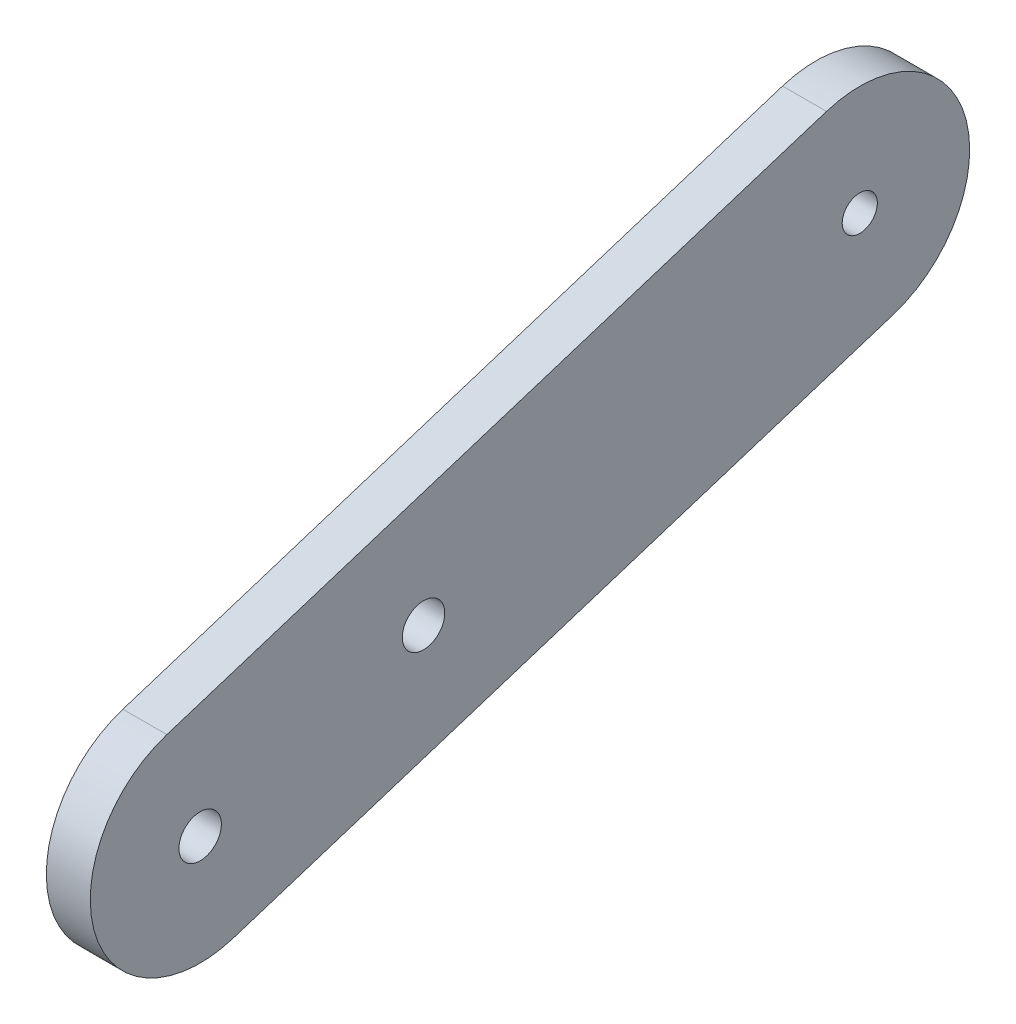
ISO-10303-21;
HEADER;
FILE_DESCRIPTION(('STEP AP214'),'2;1');
FILE_NAME('part.step','',(''),(''),'','','');
FILE_SCHEMA(('AUTOMOTIVE_DESIGN { 1 0 10303 214 1 1 1 1 }'));
ENDSEC;
DATA;
#1=APPLICATION_CONTEXT('core data for automotive mechanical design processes');
#2=APPLICATION_PROTOCOL_DEFINITION('international standard','automotive_design',2000,#1);
#3=PRODUCT_CONTEXT('',#1,'mechanical');
#4=PRODUCT('Part','Part','',(#3));
#5=PRODUCT_RELATED_PRODUCT_CATEGORY('part','',(#4));
#6=PRODUCT_DEFINITION_FORMATION('','',#4);
#7=PRODUCT_DEFINITION_CONTEXT('part definition',#1,'design');
#8=PRODUCT_DEFINITION('design','',#6,#7);
#9=PRODUCT_DEFINITION_SHAPE('','',#8);
#10=(LENGTH_UNIT() NAMED_UNIT(*) SI_UNIT(.MILLI.,.METRE.));
#11=(NAMED_UNIT(*) PLANE_ANGLE_UNIT() SI_UNIT($,.RADIAN.));
#12=(NAMED_UNIT(*) SI_UNIT($,.STERADIAN.) SOLID_ANGLE_UNIT());
#13=UNCERTAINTY_MEASURE_WITH_UNIT(LENGTH_MEASURE(1.E-05),#10,'distance_accuracy_value','');
#14=(GEOMETRIC_REPRESENTATION_CONTEXT(3) GLOBAL_UNCERTAINTY_ASSIGNED_CONTEXT((#13)) GLOBAL_UNIT_ASSIGNED_CONTEXT((#10,
#11,#12)) REPRESENTATION_CONTEXT('',''));
#15=CARTESIAN_POINT('',(0.,0.,0.));
#16=DIRECTION('',(0.,0.,1.));
#17=DIRECTION('',(1.,0.,0.));
#18=AXIS2_PLACEMENT_3D('',#15,#16,#17);
#19=CARTESIAN_POINT('',(-0.50000000278131,88922.8735174239,-279058.176608093));
#20=DIRECTION('',(0.,-0.952925780013262,-0.303203657276947));
#21=DIRECTION('',(0.,0.303203657276947,-0.952925780013262));
#22=AXIS2_PLACEMENT_3D('',#19,#20,#21);
#23=PLANE('',#22);
#24=DIRECTION('',(0.,-0.303203657276947,0.952925780013262));
#25=VECTOR('',#24,1.);
#26=CARTESIAN_POINT('',(-3.50000000278131,88922.8735174239,-279058.176608093));
#27=LINE('',#26,#25);
#28=CARTESIAN_POINT('',(-3.49999999999946,114.475973519718,53.9299584635233));
#29=VERTEX_POINT('',#28);
#30=CARTESIAN_POINT('',(-3.49999999999901,100.149754125628,98.9552194163788));
#31=VERTEX_POINT('',#30);
#32=EDGE_CURVE('E100',#29,#31,#27,.T.);
#33=ORIENTED_EDGE('',*,*,#32,.F.);
#34=DIRECTION('',(-1.,0.,0.));
#35=VECTOR('',#34,1.);
#36=CARTESIAN_POINT('',(-0.499999999999462,114.475973519718,53.9299584635233));
#37=LINE('',#36,#35);
#38=CARTESIAN_POINT('',(-0.499999999999462,114.475973519718,53.9299584635233));
#39=VERTEX_POINT('',#38);
#40=EDGE_CURVE('E11',#39,#29,#37,.T.);
#41=ORIENTED_EDGE('',*,*,#40,.F.);
#42=DIRECTION('',(0.,-0.303203657276947,0.952925780013262));
#43=VECTOR('',#42,1.);
#44=CARTESIAN_POINT('',(-0.50000000278131,88922.8735174239,-279058.176608093));
#45=LINE('',#44,#43);
#46=CARTESIAN_POINT('',(-0.499999999999014,100.149754125628,98.9552194163788));
#47=VERTEX_POINT('',#46);
#48=EDGE_CURVE('E93',#39,#47,#45,.T.);
#49=ORIENTED_EDGE('',*,*,#48,.T.);
#50=DIRECTION('',(-1.,0.,0.));
#51=VECTOR('',#50,1.);
#52=CARTESIAN_POINT('',(-0.499999999999014,100.149754125628,98.9552194163788));
#53=LINE('',#52,#51);
#54=EDGE_CURVE('E38',#47,#31,#53,.T.);
#55=ORIENTED_EDGE('',*,*,#54,.T.);
#56=EDGE_LOOP('',(#33,#41,#49,#55));
#57=FACE_BOUND('',#56,.T.);
#58=ADVANCED_FACE('F35',(#57),#23,.T.);
#59=CARTESIAN_POINT('',(-0.49999999999944,121.622916869839,56.2039858930346));
#60=DIRECTION('',(-1.,0.,0.));
#61=DIRECTION('',(0.,0.,1.));
#62=AXIS2_PLACEMENT_3D('',#59,#60,#61);
#63=CYLINDRICAL_SURFACE('',#62,7.49999999999999);
#64=CARTESIAN_POINT('',(-3.49999999999944,121.622916869839,56.2039858930346));
#65=DIRECTION('',(-1.,0.,0.));
#66=DIRECTION('',(0.,0.,1.));
#67=AXIS2_PLACEMENT_3D('',#64,#65,#66);
#68=CIRCLE('',#67,7.49999999999999);
#69=CARTESIAN_POINT('',(-3.49999999999942,128.769860219924,58.4780133226575));
#70=VERTEX_POINT('',#69);
#71=EDGE_CURVE('E95',#70,#29,#68,.T.);
#72=ORIENTED_EDGE('',*,*,#71,.F.);
#73=DIRECTION('',(-1.,0.,0.));
#74=VECTOR('',#73,1.);
#75=CARTESIAN_POINT('',(-0.499999999999417,128.769860219924,58.4780133226575));
#76=LINE('',#75,#74);
#77=CARTESIAN_POINT('',(-0.499999999999417,128.769860219924,58.4780133226575));
#78=VERTEX_POINT('',#77);
#79=EDGE_CURVE('E44',#78,#70,#76,.T.);
#80=ORIENTED_EDGE('',*,*,#79,.F.);
#81=CARTESIAN_POINT('',(-0.49999999999944,121.622916869839,56.2039858930346));
#82=DIRECTION('',(-1.,0.,0.));
#83=DIRECTION('',(0.,0.,1.));
#84=AXIS2_PLACEMENT_3D('',#81,#82,#83);
#85=CIRCLE('',#84,7.49999999999999);
#86=EDGE_CURVE('E90',#78,#39,#85,.T.);
#87=ORIENTED_EDGE('',*,*,#86,.T.);
#88=ORIENTED_EDGE('',*,*,#40,.T.);
#89=EDGE_LOOP('',(#72,#80,#87,#88));
#90=FACE_BOUND('',#89,.T.);
#91=ADVANCED_FACE('F111',(#90),#63,.T.);
#92=CARTESIAN_POINT('',(-0.500000002781265,88937.1674041242,-279053.628553233));
#93=DIRECTION('',(0.,0.952925780013262,0.303203657276948));
#94=DIRECTION('',(0.,-0.303203657276948,0.952925780013262));
#95=AXIS2_PLACEMENT_3D('',#92,#93,#94);
#96=PLANE('',#95);
#97=DIRECTION('',(0.,0.303203657276948,-0.952925780013262));
#98=VECTOR('',#97,1.);
#99=CARTESIAN_POINT('',(-3.50000000278126,88937.1674041242,-279053.628553233));
#100=LINE('',#99,#98);
#101=CARTESIAN_POINT('',(-3.49999999999897,114.443640825826,103.503274275567));
#102=VERTEX_POINT('',#101);
#103=EDGE_CURVE('E85',#102,#70,#100,.T.);
#104=ORIENTED_EDGE('',*,*,#103,.F.);
#105=DIRECTION('',(-1.,0.,0.));
#106=VECTOR('',#105,1.);
#107=CARTESIAN_POINT('',(-0.499999999998969,114.443640825826,103.503274275567));
#108=LINE('',#107,#106);
#109=CARTESIAN_POINT('',(-0.499999999998969,114.443640825826,103.503274275567));
#110=VERTEX_POINT('',#109);
#111=EDGE_CURVE('E80',#110,#102,#108,.T.);
#112=ORIENTED_EDGE('',*,*,#111,.F.);
#113=DIRECTION('',(0.,0.303203657276948,-0.952925780013262));
#114=VECTOR('',#113,1.);
#115=CARTESIAN_POINT('',(-0.500000002781265,88937.1674041242,-279053.628553233));
#116=LINE('',#115,#114);
#117=EDGE_CURVE('E83',#110,#78,#116,.T.);
#118=ORIENTED_EDGE('',*,*,#117,.T.);
#119=ORIENTED_EDGE('',*,*,#79,.T.);
#120=EDGE_LOOP('',(#104,#112,#118,#119));
#121=FACE_BOUND('',#120,.T.);
#122=ADVANCED_FACE('F82',(#121),#96,.T.);
#123=CARTESIAN_POINT('',(-0.499999999998991,107.296697475724,101.229246845967));
#124=DIRECTION('',(-1.,0.,0.));
#125=DIRECTION('',(0.,0.,1.));
#126=AXIS2_PLACEMENT_3D('',#123,#124,#125);
#127=CYLINDRICAL_SURFACE('',#126,7.49999999999997);
#128=CARTESIAN_POINT('',(-3.49999999999899,107.296697475724,101.229246845967));
#129=DIRECTION('',(-1.,0.,0.));
#130=DIRECTION('',(0.,0.,1.));
#131=AXIS2_PLACEMENT_3D('',#128,#129,#130);
#132=CIRCLE('',#131,7.49999999999997);
#133=EDGE_CURVE('E103',#31,#102,#132,.T.);
#134=ORIENTED_EDGE('',*,*,#133,.F.);
#135=ORIENTED_EDGE('',*,*,#54,.F.);
#136=CARTESIAN_POINT('',(-0.499999999998991,107.296697475724,101.229246845967));
#137=DIRECTION('',(-1.,0.,0.));
#138=DIRECTION('',(0.,0.,1.));
#139=AXIS2_PLACEMENT_3D('',#136,#137,#138);
#140=CIRCLE('',#139,7.49999999999997);
#141=EDGE_CURVE('E89',#47,#110,#140,.T.);
#142=ORIENTED_EDGE('',*,*,#141,.T.);
#143=ORIENTED_EDGE('',*,*,#111,.T.);
#144=EDGE_LOOP('',(#134,#135,#142,#143));
#145=FACE_BOUND('',#144,.T.);
#146=ADVANCED_FACE('F92',(#145),#127,.T.);
#147=CARTESIAN_POINT('',(-0.499999999998991,107.296697475724,101.229246845967));
#148=DIRECTION('',(-1.,0.,0.));
#149=DIRECTION('',(0.,0.,1.));
#150=AXIS2_PLACEMENT_3D('',#147,#148,#149);
#151=PLANE('',#150);
#152=CARTESIAN_POINT('',(-0.49999999999944,121.622916869839,56.2039858930346));
#153=DIRECTION('',(-1.,0.,0.));
#154=DIRECTION('',(0.,0.,1.));
#155=AXIS2_PLACEMENT_3D('',#152,#153,#154);
#156=CIRCLE('',#155,1.19999999999999);
#157=CARTESIAN_POINT('',(-0.499999999999428,121.622916869839,57.4039858930346));
#158=VERTEX_POINT('',#157);
#159=EDGE_CURVE('E148',#158,#158,#156,.T.);
#160=ORIENTED_EDGE('',*,*,#159,.T.);
#161=EDGE_LOOP('',(#160));
#162=FACE_BOUND('',#161,.T.);
#163=CARTESIAN_POINT('',(-0.499999999998969,112.147955992155,85.982434365755));
#164=DIRECTION('',(-1.,0.,0.));
#165=DIRECTION('',(0.,0.,1.));
#166=AXIS2_PLACEMENT_3D('',#163,#164,#165);
#167=CIRCLE('',#166,1.44999999999999);
#168=CARTESIAN_POINT('',(-0.499999999998969,112.147955992155,87.432434365755));
#169=VERTEX_POINT('',#168);
#170=EDGE_CURVE('E158',#169,#169,#167,.T.);
#171=ORIENTED_EDGE('',*,*,#170,.T.);
#172=EDGE_LOOP('',(#171));
#173=FACE_BOUND('',#172,.T.);
#174=CARTESIAN_POINT('',(-0.499999999998969,107.296697475724,101.229246845967));
#175=DIRECTION('',(-1.,0.,0.));
#176=DIRECTION('',(0.,0.,1.));
#177=AXIS2_PLACEMENT_3D('',#174,#175,#176);
#178=CIRCLE('',#177,1.44999999999999);
#179=CARTESIAN_POINT('',(-0.499999999998969,107.296697475724,102.679246845967));
#180=VERTEX_POINT('',#179);
#181=EDGE_CURVE('E104',#180,#180,#178,.T.);
#182=ORIENTED_EDGE('',*,*,#181,.T.);
#183=EDGE_LOOP('',(#182));
#184=FACE_BOUND('',#183,.T.);
#185=ORIENTED_EDGE('',*,*,#48,.F.);
#186=ORIENTED_EDGE('',*,*,#86,.F.);
#187=ORIENTED_EDGE('',*,*,#117,.F.);
#188=ORIENTED_EDGE('',*,*,#141,.F.);
#189=EDGE_LOOP('',(#185,#186,#187,#188));
#190=FACE_BOUND('',#189,.T.);
#191=ADVANCED_FACE('F88',(#162,#173,#184,#190),#151,.F.);
#192=CARTESIAN_POINT('',(-3.49999999999899,107.296697475724,101.229246845967));
#193=DIRECTION('',(-1.,0.,0.));
#194=DIRECTION('',(0.,0.,1.));
#195=AXIS2_PLACEMENT_3D('',#192,#193,#194);
#196=PLANE('',#195);
#197=CARTESIAN_POINT('',(-3.49999999999944,121.622916869839,56.2039858930346));
#198=DIRECTION('',(-1.,0.,0.));
#199=DIRECTION('',(0.,0.,1.));
#200=AXIS2_PLACEMENT_3D('',#197,#198,#199);
#201=CIRCLE('',#200,1.19999999999999);
#202=CARTESIAN_POINT('',(-3.49999999999943,121.622916869839,57.4039858930346));
#203=VERTEX_POINT('',#202);
#204=EDGE_CURVE('E151',#203,#203,#201,.T.);
#205=ORIENTED_EDGE('',*,*,#204,.F.);
#206=EDGE_LOOP('',(#205));
#207=FACE_BOUND('',#206,.T.);
#208=CARTESIAN_POINT('',(-3.5,112.147955992155,85.982434365755));
#209=DIRECTION('',(-1.,0.,0.));
#210=DIRECTION('',(0.,0.,1.));
#211=AXIS2_PLACEMENT_3D('',#208,#209,#210);
#212=CIRCLE('',#211,1.44999999999999);
#213=CARTESIAN_POINT('',(-3.5,112.147955992155,87.432434365755));
#214=VERTEX_POINT('',#213);
#215=EDGE_CURVE('E153',#214,#214,#212,.T.);
#216=ORIENTED_EDGE('',*,*,#215,.F.);
#217=EDGE_LOOP('',(#216));
#218=FACE_BOUND('',#217,.T.);
#219=CARTESIAN_POINT('',(-3.5,107.296697475724,101.229246845967));
#220=DIRECTION('',(-1.,0.,0.));
#221=DIRECTION('',(0.,0.,1.));
#222=AXIS2_PLACEMENT_3D('',#219,#220,#221);
#223=CIRCLE('',#222,1.44999999999999);
#224=CARTESIAN_POINT('',(-3.5,107.296697475724,102.679246845967));
#225=VERTEX_POINT('',#224);
#226=EDGE_CURVE('E161',#225,#225,#223,.T.);
#227=ORIENTED_EDGE('',*,*,#226,.F.);
#228=EDGE_LOOP('',(#227));
#229=FACE_BOUND('',#228,.T.);
#230=ORIENTED_EDGE('',*,*,#32,.T.);
#231=ORIENTED_EDGE('',*,*,#133,.T.);
#232=ORIENTED_EDGE('',*,*,#103,.T.);
#233=ORIENTED_EDGE('',*,*,#71,.T.);
#234=EDGE_LOOP('',(#230,#231,#232,#233));
#235=FACE_BOUND('',#234,.T.);
#236=ADVANCED_FACE('F110',(#207,#218,#229,#235),#196,.T.);
#237=CARTESIAN_POINT('',(-3.5,107.296697475724,101.229246845967));
#238=DIRECTION('',(-1.,0.,0.));
#239=DIRECTION('',(0.,0.,1.));
#240=AXIS2_PLACEMENT_3D('',#237,#238,#239);
#241=CYLINDRICAL_SURFACE('',#240,1.44999999999999);
#242=ORIENTED_EDGE('',*,*,#181,.F.);
#243=EDGE_LOOP('',(#242));
#244=FACE_BOUND('',#243,.T.);
#245=ORIENTED_EDGE('',*,*,#226,.T.);
#246=EDGE_LOOP('',(#245));
#247=FACE_BOUND('',#246,.T.);
#248=ADVANCED_FACE('F129',(#244,#247),#241,.F.);
#249=CARTESIAN_POINT('',(-3.5,112.147955992155,85.982434365755));
#250=DIRECTION('',(-1.,0.,0.));
#251=DIRECTION('',(0.,0.,1.));
#252=AXIS2_PLACEMENT_3D('',#249,#250,#251);
#253=CYLINDRICAL_SURFACE('',#252,1.44999999999999);
#254=ORIENTED_EDGE('',*,*,#170,.F.);
#255=EDGE_LOOP('',(#254));
#256=FACE_BOUND('',#255,.T.);
#257=ORIENTED_EDGE('',*,*,#215,.T.);
#258=EDGE_LOOP('',(#257));
#259=FACE_BOUND('',#258,.T.);
#260=ADVANCED_FACE('F136',(#256,#259),#253,.F.);
#261=CARTESIAN_POINT('',(-3.49999999999944,121.622916869839,56.2039858930346));
#262=DIRECTION('',(-1.,0.,0.));
#263=DIRECTION('',(0.,0.,1.));
#264=AXIS2_PLACEMENT_3D('',#261,#262,#263);
#265=CYLINDRICAL_SURFACE('',#264,1.19999999999999);
#266=ORIENTED_EDGE('',*,*,#159,.F.);
#267=EDGE_LOOP('',(#266));
#268=FACE_BOUND('',#267,.T.);
#269=ORIENTED_EDGE('',*,*,#204,.T.);
#270=EDGE_LOOP('',(#269));
#271=FACE_BOUND('',#270,.T.);
#272=ADVANCED_FACE('F140',(#268,#271),#265,.F.);
#273=CLOSED_SHELL('',(#58,#91,#122,#146,#191,#236,#248,#260,#272));
#274=MANIFOLD_SOLID_BREP('B2',#273);
#275=ADVANCED_BREP_SHAPE_REPRESENTATION('',(#18,#274),#14);
#276=SHAPE_DEFINITION_REPRESENTATION(#9,#275);
ENDSEC;
END-ISO-10303-21;
